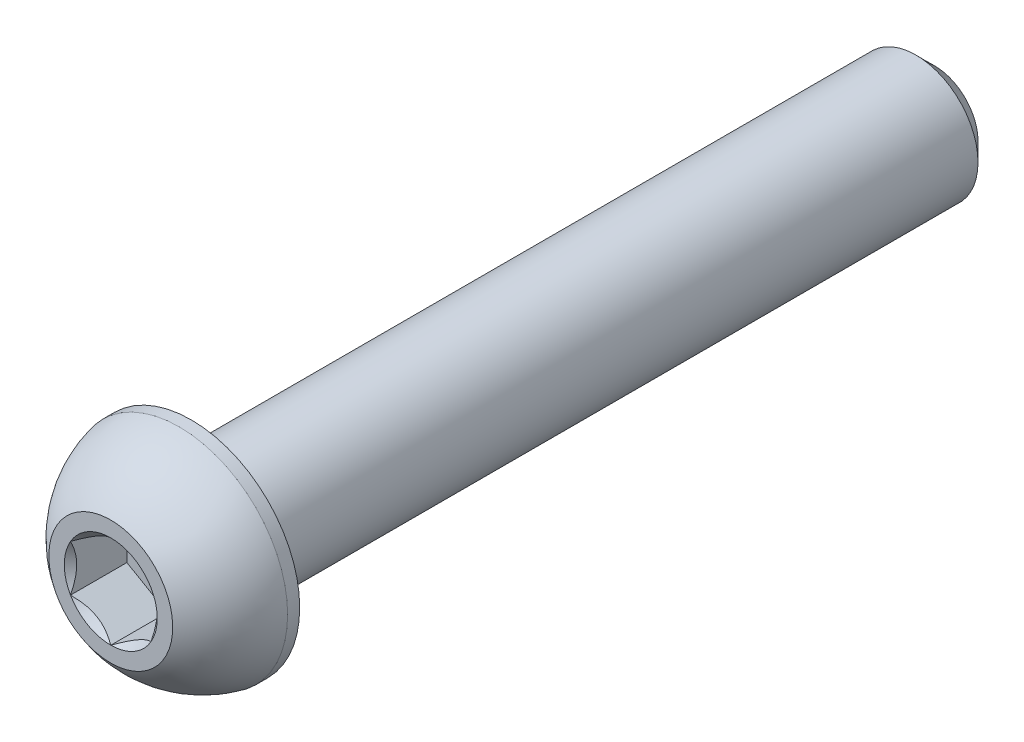
ISO-10303-21;
HEADER;
FILE_DESCRIPTION(('STEP AP214'),'2;1');
FILE_NAME('part.step','',(''),(''),'','','');
FILE_SCHEMA(('AUTOMOTIVE_DESIGN { 1 0 10303 214 1 1 1 1 }'));
ENDSEC;
DATA;
#1=APPLICATION_CONTEXT('core data for automotive mechanical design processes');
#2=APPLICATION_PROTOCOL_DEFINITION('international standard','automotive_design',2000,#1);
#3=PRODUCT_CONTEXT('',#1,'mechanical');
#4=PRODUCT('Part','Part','',(#3));
#5=PRODUCT_RELATED_PRODUCT_CATEGORY('part','',(#4));
#6=PRODUCT_DEFINITION_FORMATION('','',#4);
#7=PRODUCT_DEFINITION_CONTEXT('part definition',#1,'design');
#8=PRODUCT_DEFINITION('design','',#6,#7);
#9=PRODUCT_DEFINITION_SHAPE('','',#8);
#10=(LENGTH_UNIT() NAMED_UNIT(*) SI_UNIT(.MILLI.,.METRE.));
#11=(NAMED_UNIT(*) PLANE_ANGLE_UNIT() SI_UNIT($,.RADIAN.));
#12=(NAMED_UNIT(*) SI_UNIT($,.STERADIAN.) SOLID_ANGLE_UNIT());
#13=UNCERTAINTY_MEASURE_WITH_UNIT(LENGTH_MEASURE(1.E-05),#10,'distance_accuracy_value','');
#14=(GEOMETRIC_REPRESENTATION_CONTEXT(3) GLOBAL_UNCERTAINTY_ASSIGNED_CONTEXT((#13)) GLOBAL_UNIT_ASSIGNED_CONTEXT((#10,
#11,#12)) REPRESENTATION_CONTEXT('',''));
#15=CARTESIAN_POINT('',(0.,0.,0.));
#16=DIRECTION('',(0.,0.,1.));
#17=DIRECTION('',(1.,0.,0.));
#18=AXIS2_PLACEMENT_3D('',#15,#16,#17);
#19=CARTESIAN_POINT('',(0.,0.,-13.3));
#20=DIRECTION('',(0.,0.,1.));
#21=DIRECTION('',(1.,0.,0.));
#22=AXIS2_PLACEMENT_3D('',#19,#20,#21);
#23=PLANE('',#22);
#24=CARTESIAN_POINT('',(0.,0.,-13.3));
#25=DIRECTION('',(0.,0.,1.));
#26=DIRECTION('',(1.,0.,0.));
#27=AXIS2_PLACEMENT_3D('',#24,#25,#26);
#28=CIRCLE('',#27,0.700000000000034);
#29=CARTESIAN_POINT('',(0.700000000000034,0.,-13.3));
#30=VERTEX_POINT('',#29);
#31=EDGE_CURVE('E45',#30,#30,#28,.T.);
#32=ORIENTED_EDGE('',*,*,#31,.F.);
#33=EDGE_LOOP('',(#32));
#34=FACE_BOUND('',#33,.T.);
#35=ADVANCED_FACE('F42',(#34),#23,.F.);
#36=CARTESIAN_POINT('',(0.,0.,-13.3));
#37=DIRECTION('',(0.,0.,1.));
#38=DIRECTION('',(1.,0.,0.));
#39=AXIS2_PLACEMENT_3D('',#36,#37,#38);
#40=CONICAL_SURFACE('',#39,0.700000000000034,0.785398163397425);
#41=CARTESIAN_POINT('',(0.,0.,-13.));
#42=DIRECTION('',(0.,0.,1.));
#43=DIRECTION('',(1.,0.,0.));
#44=AXIS2_PLACEMENT_3D('',#41,#42,#43);
#45=CIRCLE('',#44,1.00000000000001);
#46=CARTESIAN_POINT('',(1.00000000000001,0.,-13.));
#47=VERTEX_POINT('',#46);
#48=EDGE_CURVE('E138',#47,#47,#45,.T.);
#49=ORIENTED_EDGE('',*,*,#48,.F.);
#50=EDGE_LOOP('',(#49));
#51=FACE_BOUND('',#50,.T.);
#52=ORIENTED_EDGE('',*,*,#31,.T.);
#53=EDGE_LOOP('',(#52));
#54=FACE_BOUND('',#53,.T.);
#55=ADVANCED_FACE('F159',(#51,#54),#40,.T.);
#56=CARTESIAN_POINT('',(0.,0.,0.));
#57=DIRECTION('',(0.,0.,1.));
#58=DIRECTION('',(1.,0.,0.));
#59=AXIS2_PLACEMENT_3D('',#56,#57,#58);
#60=CYLINDRICAL_SURFACE('',#59,1.00000000000001);
#61=CARTESIAN_POINT('',(0.,0.,-1.3));
#62=DIRECTION('',(0.,0.,1.));
#63=DIRECTION('',(1.,0.,0.));
#64=AXIS2_PLACEMENT_3D('',#61,#62,#63);
#65=CIRCLE('',#64,1.00000000000001);
#66=CARTESIAN_POINT('',(1.00000000000001,0.,-1.3));
#67=VERTEX_POINT('',#66);
#68=EDGE_CURVE('E12',#67,#67,#65,.T.);
#69=ORIENTED_EDGE('',*,*,#68,.F.);
#70=EDGE_LOOP('',(#69));
#71=FACE_BOUND('',#70,.T.);
#72=ORIENTED_EDGE('',*,*,#48,.T.);
#73=EDGE_LOOP('',(#72));
#74=FACE_BOUND('',#73,.T.);
#75=ADVANCED_FACE('F166',(#71,#74),#60,.T.);
#76=CARTESIAN_POINT('',(1.75,0.,-1.3));
#77=DIRECTION('',(0.,0.,-1.));
#78=DIRECTION('',(-1.,0.,0.));
#79=AXIS2_PLACEMENT_3D('',#76,#77,#78);
#80=PLANE('',#79);
#81=ORIENTED_EDGE('',*,*,#68,.T.);
#82=EDGE_LOOP('',(#81));
#83=FACE_BOUND('',#82,.T.);
#84=CARTESIAN_POINT('',(0.,0.,-1.3));
#85=DIRECTION('',(0.,0.,1.));
#86=DIRECTION('',(1.,0.,0.));
#87=AXIS2_PLACEMENT_3D('',#84,#85,#86);
#88=CIRCLE('',#87,1.75);
#89=CARTESIAN_POINT('',(1.75,0.,-1.3));
#90=VERTEX_POINT('',#89);
#91=EDGE_CURVE('E260',#90,#90,#88,.T.);
#92=ORIENTED_EDGE('',*,*,#91,.F.);
#93=EDGE_LOOP('',(#92));
#94=FACE_BOUND('',#93,.T.);
#95=ADVANCED_FACE('F169',(#83,#94),#80,.T.);
#96=CARTESIAN_POINT('',(0.65,-0.375277674973252,-0.91));
#97=DIRECTION('',(0.,0.,1.));
#98=DIRECTION('',(1.,0.,0.));
#99=AXIS2_PLACEMENT_3D('',#96,#97,#98);
#100=PLANE('',#99);
#101=DIRECTION('',(0.866025403784438,0.5,0.));
#102=VECTOR('',#101,1.);
#103=CARTESIAN_POINT('',(0.,-0.750555349946511,-0.91));
#104=LINE('',#103,#102);
#105=CARTESIAN_POINT('',(0.,-0.750555349946511,-0.91));
#106=VERTEX_POINT('',#105);
#107=CARTESIAN_POINT('',(0.65,-0.375277674973252,-0.91));
#108=VERTEX_POINT('',#107);
#109=EDGE_CURVE('E113',#106,#108,#104,.T.);
#110=ORIENTED_EDGE('',*,*,#109,.T.);
#111=DIRECTION('',(0.,1.,0.));
#112=VECTOR('',#111,1.);
#113=CARTESIAN_POINT('',(0.65,-0.375277674973252,-0.91));
#114=LINE('',#113,#112);
#115=CARTESIAN_POINT('',(0.65,0.375277674973256,-0.91));
#116=VERTEX_POINT('',#115);
#117=EDGE_CURVE('E296',#108,#116,#114,.T.);
#118=ORIENTED_EDGE('',*,*,#117,.T.);
#119=DIRECTION('',(-0.866025403784439,0.5,0.));
#120=VECTOR('',#119,1.);
#121=CARTESIAN_POINT('',(0.65,0.375277674973256,-0.91));
#122=LINE('',#121,#120);
#123=CARTESIAN_POINT('',(0.,0.750555349946512,-0.91));
#124=VERTEX_POINT('',#123);
#125=EDGE_CURVE('E292',#116,#124,#122,.T.);
#126=ORIENTED_EDGE('',*,*,#125,.T.);
#127=DIRECTION('',(-0.866025403784439,-0.5,0.));
#128=VECTOR('',#127,1.);
#129=CARTESIAN_POINT('',(0.,0.750555349946512,-0.91));
#130=LINE('',#129,#128);
#131=CARTESIAN_POINT('',(-0.649999999999998,0.375277674973256,-0.91));
#132=VERTEX_POINT('',#131);
#133=EDGE_CURVE('E288',#124,#132,#130,.T.);
#134=ORIENTED_EDGE('',*,*,#133,.T.);
#135=DIRECTION('',(0.,-1.,0.));
#136=VECTOR('',#135,1.);
#137=CARTESIAN_POINT('',(-0.649999999999998,0.375277674973256,-0.91));
#138=LINE('',#137,#136);
#139=CARTESIAN_POINT('',(-0.649999999999997,-0.375277674973256,-0.91));
#140=VERTEX_POINT('',#139);
#141=EDGE_CURVE('E284',#132,#140,#138,.T.);
#142=ORIENTED_EDGE('',*,*,#141,.T.);
#143=DIRECTION('',(0.866025403784438,-0.500000000000001,0.));
#144=VECTOR('',#143,1.);
#145=CARTESIAN_POINT('',(-0.649999999999997,-0.375277674973256,-0.91));
#146=LINE('',#145,#144);
#147=EDGE_CURVE('E268',#140,#106,#146,.T.);
#148=ORIENTED_EDGE('',*,*,#147,.T.);
#149=EDGE_LOOP('',(#110,#118,#126,#134,#142,#148));
#150=FACE_BOUND('',#149,.T.);
#151=ADVANCED_FACE('F162',(#150),#100,.T.);
#152=CARTESIAN_POINT('',(-0.649999999999997,-0.375277674973256,-0.91));
#153=DIRECTION('',(-0.500000000000001,-0.866025403784438,0.));
#154=DIRECTION('',(0.866025403784438,-0.500000000000001,0.));
#155=AXIS2_PLACEMENT_3D('',#152,#153,#154);
#156=PLANE('',#155);
#157=DIRECTION('',(0.,0.,1.));
#158=VECTOR('',#157,1.);
#159=CARTESIAN_POINT('',(-0.649999999999997,-0.375277674973256,-0.91));
#160=LINE('',#159,#158);
#161=CARTESIAN_POINT('',(-0.649999999999997,-0.375277674973259,0.));
#162=VERTEX_POINT('',#161);
#163=EDGE_CURVE('E120',#140,#162,#160,.T.);
#164=ORIENTED_EDGE('',*,*,#163,.T.);
#165=CARTESIAN_POINT('',(-0.650199999999997,-0.375162204919418,0.000115496696672807));
#166=CARTESIAN_POINT('',(-0.627846124557377,-0.388068220923647,-0.0127826378084549));
#167=CARTESIAN_POINT('',(-0.605119879467385,-0.401189224644023,-0.0249248451013643));
#168=CARTESIAN_POINT('',(-0.558778015356716,-0.427944712363067,-0.0471577551377746));
#169=CARTESIAN_POINT('',(-0.535157980959402,-0.441581745580625,-0.0572360751899938));
#170=CARTESIAN_POINT('',(-0.487526191293143,-0.469081972166423,-0.0744984835766257));
#171=CARTESIAN_POINT('',(-0.463526635406913,-0.482938122217769,-0.081726041484421));
#172=CARTESIAN_POINT('',(-0.41501058975479,-0.510948874235039,-0.0928707979999934));
#173=CARTESIAN_POINT('',(-0.390495555958118,-0.52510263559674,-0.096796297378132));
#174=CARTESIAN_POINT('',(-0.33061559766408,-0.559674345636867,-0.101776562665293));
#175=CARTESIAN_POINT('',(-0.295110807096765,-0.580173046028428,-0.100875515207342));
#176=CARTESIAN_POINT('',(-0.224845447682006,-0.620740770201245,-0.0915914386833309));
#177=CARTESIAN_POINT('',(-0.190086069560699,-0.640809106516445,-0.0831972369703432));
#178=CARTESIAN_POINT('',(-0.129041737491061,-0.676053068069351,-0.062954321492702));
#179=CARTESIAN_POINT('',(-0.102476138584916,-0.691390723748998,-0.0521615767354973));
#180=CARTESIAN_POINT('',(-0.0503858451009351,-0.721465068714141,-0.0278480685503986));
#181=CARTESIAN_POINT('',(-0.0248580811749664,-0.736203530088608,-0.0143361789927113));
#182=CARTESIAN_POINT('',(0.00019999999999743,-0.750670820000349,0.000115496696673118));
#183=B_SPLINE_CURVE_WITH_KNOTS('',3,(#165,#166,#167,#168,#169,#170,#171,#172,#173,#174,#175,
#176,#177,#178,#179,#180,#181,#182),.UNSPECIFIED.,.F.,.F.,(4,2,2,2,2,2,2,2,4),(0.,
0.0866236559063438,0.173752711623241,0.259496442803566,0.34502398028175,0.467267720550123,
0.589694037029333,0.687111308755476,0.78421567181366),.UNSPECIFIED.);
#184=CARTESIAN_POINT('',(0.,-0.750555349946512,0.));
#185=VERTEX_POINT('',#184);
#186=EDGE_CURVE('E102',#162,#185,#183,.T.);
#187=ORIENTED_EDGE('',*,*,#186,.T.);
#188=DIRECTION('',(0.,0.,1.));
#189=VECTOR('',#188,1.);
#190=CARTESIAN_POINT('',(0.,-0.750555349946511,-0.91));
#191=LINE('',#190,#189);
#192=EDGE_CURVE('E119',#106,#185,#191,.T.);
#193=ORIENTED_EDGE('',*,*,#192,.F.);
#194=ORIENTED_EDGE('',*,*,#147,.F.);
#195=EDGE_LOOP('',(#164,#187,#193,#194));
#196=FACE_BOUND('',#195,.T.);
#197=ADVANCED_FACE('F117',(#196),#156,.F.);
#198=CARTESIAN_POINT('',(0.,-0.750555349946511,-0.91));
#199=DIRECTION('',(0.500000000000001,-0.866025403784438,0.));
#200=DIRECTION('',(0.866025403784438,0.500000000000001,0.));
#201=AXIS2_PLACEMENT_3D('',#198,#199,#200);
#202=PLANE('',#201);
#203=ORIENTED_EDGE('',*,*,#192,.T.);
#204=CARTESIAN_POINT('',(-0.000200000000002532,-0.750670820000349,0.000115496696673219));
#205=CARTESIAN_POINT('',(0.0221538754426182,-0.737764803996121,-0.0127826378084547));
#206=CARTESIAN_POINT('',(0.0448801205326102,-0.724643800275745,-0.0249248451013643));
#207=CARTESIAN_POINT('',(0.0912219846432802,-0.6978883125567,-0.0471577551377752));
#208=CARTESIAN_POINT('',(0.114842019040594,-0.684251279339143,-0.0572360751899947));
#209=CARTESIAN_POINT('',(0.162473808706854,-0.656751052753344,-0.074498483576627));
#210=CARTESIAN_POINT('',(0.186473364593084,-0.642894902701998,-0.0817260414844226));
#211=CARTESIAN_POINT('',(0.234989410245208,-0.614884150684728,-0.0928707979999952));
#212=CARTESIAN_POINT('',(0.259504444041879,-0.600730389323027,-0.0967962973781341));
#213=CARTESIAN_POINT('',(0.319384402335918,-0.5661586792829,-0.101776562665295));
#214=CARTESIAN_POINT('',(0.354889192903233,-0.545659978891339,-0.100875515207344));
#215=CARTESIAN_POINT('',(0.425154552317992,-0.505092254718522,-0.0915914386833333));
#216=CARTESIAN_POINT('',(0.459913930439299,-0.485023918403322,-0.0831972369703457));
#217=CARTESIAN_POINT('',(0.520958262508937,-0.449779956850415,-0.0629543214927043));
#218=CARTESIAN_POINT('',(0.547523861415084,-0.434442301170768,-0.0521615767354993));
#219=CARTESIAN_POINT('',(0.599614154899066,-0.404367956205624,-0.0278480685503996));
#220=CARTESIAN_POINT('',(0.625141918825036,-0.389629494831156,-0.0143361789927117));
#221=CARTESIAN_POINT('',(0.6502,-0.375162204919414,0.000115496696673408));
#222=B_SPLINE_CURVE_WITH_KNOTS('',3,(#204,#205,#206,#207,#208,#209,#210,#211,#212,#213,#214,
#215,#216,#217,#218,#219,#220,#221),.UNSPECIFIED.,.F.,.F.,(4,2,2,2,2,2,2,2,4),(0.,
0.0866236559063447,0.173752711623243,0.259496442803569,0.345023980281754,0.467267720550126,
0.589694037029336,0.687111308755483,0.78421567181367),.UNSPECIFIED.);
#223=CARTESIAN_POINT('',(0.65,-0.375277674973254,0.));
#224=VERTEX_POINT('',#223);
#225=EDGE_CURVE('E109',#185,#224,#222,.T.);
#226=ORIENTED_EDGE('',*,*,#225,.T.);
#227=DIRECTION('',(0.,0.,1.));
#228=VECTOR('',#227,1.);
#229=CARTESIAN_POINT('',(0.65,-0.375277674973252,-0.91));
#230=LINE('',#229,#228);
#231=EDGE_CURVE('E65',#108,#224,#230,.T.);
#232=ORIENTED_EDGE('',*,*,#231,.F.);
#233=ORIENTED_EDGE('',*,*,#109,.F.);
#234=EDGE_LOOP('',(#203,#226,#232,#233));
#235=FACE_BOUND('',#234,.T.);
#236=ADVANCED_FACE('F124',(#235),#202,.F.);
#237=CARTESIAN_POINT('',(0.65,-0.375277674973252,-0.91));
#238=DIRECTION('',(1.,0.,0.));
#239=DIRECTION('',(0.,0.,-1.));
#240=AXIS2_PLACEMENT_3D('',#237,#238,#239);
#241=PLANE('',#240);
#242=ORIENTED_EDGE('',*,*,#231,.T.);
#243=CARTESIAN_POINT('',(0.65,-0.748456856201993,0.240750690384005));
#244=CARTESIAN_POINT('',(0.65,-0.711991073878816,0.213280285933621));
#245=CARTESIAN_POINT('',(0.65,-0.675139640082794,0.186265195476194));
#246=CARTESIAN_POINT('',(0.65,-0.600031183452819,0.133629348283163));
#247=CARTESIAN_POINT('',(0.65,-0.561765441270894,0.108021106129097));
#248=CARTESIAN_POINT('',(0.65,-0.481525479406319,0.0577374937624613));
#249=CARTESIAN_POINT('',(0.65,-0.439464253670484,0.0331988021987558));
#250=CARTESIAN_POINT('',(0.65,-0.353242719412717,-0.0116853403013637));
#251=CARTESIAN_POINT('',(0.65,-0.309090130602523,-0.0320449275105113));
#252=CARTESIAN_POINT('',(0.65,-0.242810057498668,-0.0569512709113473));
#253=CARTESIAN_POINT('',(0.65,-0.221667349821687,-0.0640992725852869));
#254=CARTESIAN_POINT('',(0.65,-0.178882845085541,-0.0767024705474531));
#255=CARTESIAN_POINT('',(0.65,-0.157241013753962,-0.0821575502168733));
#256=CARTESIAN_POINT('',(0.65,-0.0924732258239327,-0.0953392346897749));
#257=CARTESIAN_POINT('',(0.65,-0.0486986201802761,-0.100206440230559));
#258=CARTESIAN_POINT('',(0.65,0.0373331587621249,-0.10085551076922));
#259=CARTESIAN_POINT('',(0.65,0.0795879418799275,-0.0969596606801929));
#260=CARTESIAN_POINT('',(0.65,0.142230570834976,-0.0855076744021655));
#261=CARTESIAN_POINT('',(0.65,0.163174856664669,-0.080685435763269));
#262=CARTESIAN_POINT('',(0.65,0.204615212735414,-0.0693999000452562));
#263=CARTESIAN_POINT('',(0.65,0.225111320324617,-0.0629367402798553));
#264=CARTESIAN_POINT('',(0.65,0.289638534772371,-0.0401559078683569));
#265=CARTESIAN_POINT('',(0.65,0.332748206875051,-0.0212427548657985));
#266=CARTESIAN_POINT('',(0.65,0.416943840013234,0.0208112818887808));
#267=CARTESIAN_POINT('',(0.65,0.45802183453077,0.0439673547577785));
#268=CARTESIAN_POINT('',(0.65,0.53652923324599,0.0917266397180912));
#269=CARTESIAN_POINT('',(0.65,0.574038509134623,0.116200758127156));
#270=CARTESIAN_POINT('',(0.65,0.647609691485458,0.166623456014885));
#271=CARTESIAN_POINT('',(0.65,0.683680924535921,0.192558343655291));
#272=CARTESIAN_POINT('',(0.65,0.719356204751142,0.218966877397434));
#273=B_SPLINE_CURVE_WITH_KNOTS('',3,(#243,#244,#245,#246,#247,#248,#249,#250,#251,#252,#253,
#254,#255,#256,#257,#258,#259,#260,#261,#262,#263,#264,#265,#266,#267,#268,#269,#270,#271,#272),
.UNSPECIFIED.,.F.,.F.,(4,2,2,2,2,2,2,2,2,2,2,2,2,2,4),(0.,0.137014030009578,0.275096405762551,
0.421060359835522,0.566522128775089,0.633415056462916,0.7003125911218,0.831534924508334,
0.958010408789896,1.02242898521265,1.08684217280828,1.22766018796412,1.36899252873703,
1.50330165960873,1.63651263433843),.UNSPECIFIED.);
#274=CARTESIAN_POINT('',(0.65,0.375277674973254,0.));
#275=VERTEX_POINT('',#274);
#276=EDGE_CURVE('E189',#224,#275,#273,.T.);
#277=ORIENTED_EDGE('',*,*,#276,.T.);
#278=DIRECTION('',(0.,0.,1.));
#279=VECTOR('',#278,1.);
#280=CARTESIAN_POINT('',(0.65,0.375277674973256,-0.91));
#281=LINE('',#280,#279);
#282=EDGE_CURVE('E269',#116,#275,#281,.T.);
#283=ORIENTED_EDGE('',*,*,#282,.F.);
#284=ORIENTED_EDGE('',*,*,#117,.F.);
#285=EDGE_LOOP('',(#242,#277,#283,#284));
#286=FACE_BOUND('',#285,.T.);
#287=ADVANCED_FACE('F234',(#286),#241,.F.);
#288=CARTESIAN_POINT('',(0.65,0.375277674973256,-0.91));
#289=DIRECTION('',(0.5,0.866025403784439,0.));
#290=DIRECTION('',(-0.866025403784439,0.5,0.));
#291=AXIS2_PLACEMENT_3D('',#288,#289,#290);
#292=PLANE('',#291);
#293=ORIENTED_EDGE('',*,*,#282,.T.);
#294=CARTESIAN_POINT('',(0.6502,0.375162204919418,0.000115496696675192));
#295=CARTESIAN_POINT('',(0.62784612455738,0.388068220923646,-0.0127826378084528));
#296=CARTESIAN_POINT('',(0.605119879467388,0.401189224644023,-0.0249248451013623));
#297=CARTESIAN_POINT('',(0.558778015356718,0.427944712363067,-0.0471577551377729));
#298=CARTESIAN_POINT('',(0.535157980959404,0.441581745580624,-0.0572360751899923));
#299=CARTESIAN_POINT('',(0.487526191293144,0.469081972166423,-0.0744984835766245));
#300=CARTESIAN_POINT('',(0.463526635406914,0.482938122217769,-0.08172604148442));
#301=CARTESIAN_POINT('',(0.415010589754791,0.510948874235039,-0.0928707979999926));
#302=CARTESIAN_POINT('',(0.390495555958119,0.52510263559674,-0.0967962973781314));
#303=CARTESIAN_POINT('',(0.33061559766408,0.559674345636867,-0.101776562665292));
#304=CARTESIAN_POINT('',(0.295110807096765,0.580173046028428,-0.100875515207341));
#305=CARTESIAN_POINT('',(0.224845447682006,0.620740770201245,-0.0915914386833307));
#306=CARTESIAN_POINT('',(0.190086069560699,0.640809106516445,-0.083197236970343));
#307=CARTESIAN_POINT('',(0.129041737491061,0.676053068069352,-0.0629543214927018));
#308=CARTESIAN_POINT('',(0.102476138584915,0.691390723748998,-0.0521615767354971));
#309=CARTESIAN_POINT('',(0.0503858451009338,0.721465068714142,-0.0278480685503981));
#310=CARTESIAN_POINT('',(0.0248580811749648,0.736203530088609,-0.0143361789927107));
#311=CARTESIAN_POINT('',(-0.000199999999999354,0.75067082000035,0.000115496696673986));
#312=B_SPLINE_CURVE_WITH_KNOTS('',3,(#294,#295,#296,#297,#298,#299,#300,#301,#302,#303,#304,
#305,#306,#307,#308,#309,#310,#311),.UNSPECIFIED.,.F.,.F.,(4,2,2,2,2,2,2,2,4),(0.,
0.0866236559063445,0.173752711623243,0.259496442803569,0.345023980281753,0.467267720550126,
0.589694037029336,0.687111308755481,0.784215671813665),.UNSPECIFIED.);
#313=CARTESIAN_POINT('',(0.,0.750555349946512,0.));
#314=VERTEX_POINT('',#313);
#315=EDGE_CURVE('E143',#275,#314,#312,.T.);
#316=ORIENTED_EDGE('',*,*,#315,.T.);
#317=DIRECTION('',(0.,0.,1.));
#318=VECTOR('',#317,1.);
#319=CARTESIAN_POINT('',(0.,0.750555349946512,-0.91));
#320=LINE('',#319,#318);
#321=EDGE_CURVE('E273',#124,#314,#320,.T.);
#322=ORIENTED_EDGE('',*,*,#321,.F.);
#323=ORIENTED_EDGE('',*,*,#125,.F.);
#324=EDGE_LOOP('',(#293,#316,#322,#323));
#325=FACE_BOUND('',#324,.T.);
#326=ADVANCED_FACE('F230',(#325),#292,.F.);
#327=CARTESIAN_POINT('',(0.,0.750555349946512,-0.91));
#328=DIRECTION('',(-0.5,0.866025403784439,0.));
#329=DIRECTION('',(-0.866025403784439,-0.5,0.));
#330=AXIS2_PLACEMENT_3D('',#327,#328,#329);
#331=PLANE('',#330);
#332=ORIENTED_EDGE('',*,*,#321,.T.);
#333=CARTESIAN_POINT('',(0.000200000000000687,0.75067082000035,0.000115496696674086));
#334=CARTESIAN_POINT('',(-0.0221538754426199,0.737764803996122,-0.0127826378084537));
#335=CARTESIAN_POINT('',(-0.0448801205326119,0.724643800275746,-0.0249248451013632));
#336=CARTESIAN_POINT('',(-0.0912219846432817,0.697888312556701,-0.0471577551377739));
#337=CARTESIAN_POINT('',(-0.114842019040596,0.684251279339144,-0.0572360751899933));
#338=CARTESIAN_POINT('',(-0.162473808706855,0.656751052753345,-0.0744984835766254));
#339=CARTESIAN_POINT('',(-0.186473364593085,0.642894902701999,-0.0817260414844208));
#340=CARTESIAN_POINT('',(-0.234989410245209,0.614884150684729,-0.0928707979999933));
#341=CARTESIAN_POINT('',(-0.25950444404188,0.600730389323028,-0.0967962973781321));
#342=CARTESIAN_POINT('',(-0.319384402335919,0.566158679282901,-0.101776562665293));
#343=CARTESIAN_POINT('',(-0.354889192903234,0.545659978891341,-0.100875515207342));
#344=CARTESIAN_POINT('',(-0.425154552317993,0.505092254718524,-0.0915914386833313));
#345=CARTESIAN_POINT('',(-0.4599139304393,0.485023918403323,-0.0831972369703435));
#346=CARTESIAN_POINT('',(-0.520958262508938,0.449779956850417,-0.0629543214927024));
#347=CARTESIAN_POINT('',(-0.547523861415084,0.43444230117077,-0.0521615767354977));
#348=CARTESIAN_POINT('',(-0.599614154899065,0.404367956205627,-0.0278480685503987));
#349=CARTESIAN_POINT('',(-0.625141918825034,0.389629494831159,-0.0143361789927112));
#350=CARTESIAN_POINT('',(-0.650199999999998,0.375162204919418,0.0001154966966736));
#351=B_SPLINE_CURVE_WITH_KNOTS('',3,(#333,#334,#335,#336,#337,#338,#339,#340,#341,#342,#343,
#344,#345,#346,#347,#348,#349,#350),.UNSPECIFIED.,.F.,.F.,(4,2,2,2,2,2,2,2,4),(0.,
0.0866236559063444,0.173752711623242,0.259496442803568,0.345023980281752,0.467267720550125,
0.589694037029335,0.68711130875548,0.784215671813665),.UNSPECIFIED.);
#352=CARTESIAN_POINT('',(-0.649999999999998,0.375277674973256,0.));
#353=VERTEX_POINT('',#352);
#354=EDGE_CURVE('E199',#314,#353,#351,.T.);
#355=ORIENTED_EDGE('',*,*,#354,.T.);
#356=DIRECTION('',(0.,0.,1.));
#357=VECTOR('',#356,1.);
#358=CARTESIAN_POINT('',(-0.649999999999998,0.375277674973256,-0.91));
#359=LINE('',#358,#357);
#360=EDGE_CURVE('E277',#132,#353,#359,.T.);
#361=ORIENTED_EDGE('',*,*,#360,.F.);
#362=ORIENTED_EDGE('',*,*,#133,.F.);
#363=EDGE_LOOP('',(#332,#355,#361,#362));
#364=FACE_BOUND('',#363,.T.);
#365=ADVANCED_FACE('F226',(#364),#331,.F.);
#366=CARTESIAN_POINT('',(-0.649999999999998,0.375277674973256,-0.91));
#367=DIRECTION('',(-1.,0.,0.));
#368=DIRECTION('',(0.,-1.,0.));
#369=AXIS2_PLACEMENT_3D('',#366,#367,#368);
#370=PLANE('',#369);
#371=ORIENTED_EDGE('',*,*,#360,.T.);
#372=CARTESIAN_POINT('',(-0.649999999999997,-0.748456856202,0.240750690384008));
#373=CARTESIAN_POINT('',(-0.649999999999997,-0.711991073878822,0.213280285933623));
#374=CARTESIAN_POINT('',(-0.649999999999997,-0.6751396400828,0.186265195476196));
#375=CARTESIAN_POINT('',(-0.649999999999997,-0.600031183452825,0.133629348283164));
#376=CARTESIAN_POINT('',(-0.649999999999997,-0.561765441270899,0.108021106129098));
#377=CARTESIAN_POINT('',(-0.649999999999997,-0.481525479406324,0.0577374937624617));
#378=CARTESIAN_POINT('',(-0.649999999999997,-0.439464253670489,0.0331988021987558));
#379=CARTESIAN_POINT('',(-0.649999999999997,-0.353242719412722,-0.0116853403013644));
#380=CARTESIAN_POINT('',(-0.649999999999997,-0.309090130602527,-0.0320449275105122));
#381=CARTESIAN_POINT('',(-0.649999999999997,-0.242810057498671,-0.0569512709113487));
#382=CARTESIAN_POINT('',(-0.649999999999998,-0.221667349821691,-0.0640992725852885));
#383=CARTESIAN_POINT('',(-0.649999999999998,-0.178882845085544,-0.076702470547455));
#384=CARTESIAN_POINT('',(-0.649999999999998,-0.157241013753965,-0.0821575502168752));
#385=CARTESIAN_POINT('',(-0.649999999999998,-0.092473225823936,-0.0953392346897771));
#386=CARTESIAN_POINT('',(-0.649999999999998,-0.0486986201802792,-0.100206440230561));
#387=CARTESIAN_POINT('',(-0.649999999999998,0.0373331587621221,-0.100855510769223));
#388=CARTESIAN_POINT('',(-0.649999999999998,0.0795879418799249,-0.0969596606801957));
#389=CARTESIAN_POINT('',(-0.649999999999998,0.142230570834973,-0.0855076744021684));
#390=CARTESIAN_POINT('',(-0.649999999999998,0.163174856664667,-0.080685435763272));
#391=CARTESIAN_POINT('',(-0.649999999999998,0.204615212735411,-0.0693999000452592));
#392=CARTESIAN_POINT('',(-0.649999999999998,0.225111320324615,-0.0629367402798583));
#393=CARTESIAN_POINT('',(-0.649999999999998,0.289638534772368,-0.0401559078683601));
#394=CARTESIAN_POINT('',(-0.649999999999998,0.332748206875048,-0.0212427548658018));
#395=CARTESIAN_POINT('',(-0.649999999999998,0.41694384001323,0.0208112818887772));
#396=CARTESIAN_POINT('',(-0.649999999999998,0.458021834530766,0.0439673547577745));
#397=CARTESIAN_POINT('',(-0.649999999999998,0.536529233245986,0.0917266397180868));
#398=CARTESIAN_POINT('',(-0.649999999999998,0.574038509134618,0.116200758127151));
#399=CARTESIAN_POINT('',(-0.649999999999999,0.647609691485453,0.166623456014881));
#400=CARTESIAN_POINT('',(-0.649999999999999,0.683680924535915,0.192558343655286));
#401=CARTESIAN_POINT('',(-0.649999999999999,0.719356204751137,0.218966877397429));
#402=B_SPLINE_CURVE_WITH_KNOTS('',3,(#372,#373,#374,#375,#376,#377,#378,#379,#380,#381,#382,
#383,#384,#385,#386,#387,#388,#389,#390,#391,#392,#393,#394,#395,#396,#397,#398,#399,#400,#401),
.UNSPECIFIED.,.F.,.F.,(4,2,2,2,2,2,2,2,2,2,2,2,2,2,4),(0.,0.13701403000958,0.275096405762553,
0.421060359835525,0.566522128775094,0.633415056462921,0.700312591121805,0.83153492450834,
0.958010408789902,1.02242898521266,1.08684217280828,1.22766018796413,1.36899252873703,
1.50330165960873,1.63651263433843),.UNSPECIFIED.);
#403=EDGE_CURVE('E122',#353,#162,#402,.F.);
#404=ORIENTED_EDGE('',*,*,#403,.T.);
#405=ORIENTED_EDGE('',*,*,#163,.F.);
#406=ORIENTED_EDGE('',*,*,#141,.F.);
#407=EDGE_LOOP('',(#371,#404,#405,#406));
#408=FACE_BOUND('',#407,.T.);
#409=ADVANCED_FACE('F223',(#408),#370,.F.);
#410=CARTESIAN_POINT('',(0.,0.,0.));
#411=DIRECTION('',(0.,0.,1.));
#412=DIRECTION('',(1.,0.,0.));
#413=AXIS2_PLACEMENT_3D('',#410,#411,#412);
#414=CONICAL_SURFACE('',#413,0.750555349946512,0.78539816339745);
#415=CARTESIAN_POINT('',(0.,0.,0.));
#416=DIRECTION('',(0.,0.,1.));
#417=DIRECTION('',(1.,0.,0.));
#418=AXIS2_PLACEMENT_3D('',#415,#416,#417);
#419=CIRCLE('',#418,0.750555349946512);
#420=EDGE_CURVE('E99',#162,#185,#419,.T.);
#421=ORIENTED_EDGE('',*,*,#420,.T.);
#422=ORIENTED_EDGE('',*,*,#186,.F.);
#423=EDGE_LOOP('',(#421,#422));
#424=FACE_BOUND('',#423,.T.);
#425=ADVANCED_FACE('F100',(#424),#414,.F.);
#426=EDGE_CURVE('E57',#185,#224,#419,.T.);
#427=ORIENTED_EDGE('',*,*,#426,.T.);
#428=ORIENTED_EDGE('',*,*,#225,.F.);
#429=EDGE_LOOP('',(#427,#428));
#430=FACE_BOUND('',#429,.T.);
#431=ADVANCED_FACE('F110',(#430),#414,.F.);
#432=EDGE_CURVE('E135',#224,#275,#419,.T.);
#433=ORIENTED_EDGE('',*,*,#432,.T.);
#434=ORIENTED_EDGE('',*,*,#276,.F.);
#435=EDGE_LOOP('',(#433,#434));
#436=FACE_BOUND('',#435,.T.);
#437=ADVANCED_FACE('F184',(#436),#414,.F.);
#438=EDGE_CURVE('E139',#275,#314,#419,.T.);
#439=ORIENTED_EDGE('',*,*,#438,.T.);
#440=ORIENTED_EDGE('',*,*,#315,.F.);
#441=EDGE_LOOP('',(#439,#440));
#442=FACE_BOUND('',#441,.T.);
#443=ADVANCED_FACE('F322',(#442),#414,.F.);
#444=EDGE_CURVE('E142',#314,#353,#419,.T.);
#445=ORIENTED_EDGE('',*,*,#444,.T.);
#446=ORIENTED_EDGE('',*,*,#354,.F.);
#447=EDGE_LOOP('',(#445,#446));
#448=FACE_BOUND('',#447,.T.);
#449=ADVANCED_FACE('F318',(#448),#414,.F.);
#450=EDGE_CURVE('E107',#353,#162,#419,.T.);
#451=ORIENTED_EDGE('',*,*,#450,.T.);
#452=ORIENTED_EDGE('',*,*,#403,.F.);
#453=EDGE_LOOP('',(#451,#452));
#454=FACE_BOUND('',#453,.T.);
#455=ADVANCED_FACE('F248',(#454),#414,.F.);
#456=CARTESIAN_POINT('',(0.,-1.00000000000001,0.));
#457=DIRECTION('',(0.,0.,-1.));
#458=DIRECTION('',(-1.,0.,0.));
#459=AXIS2_PLACEMENT_3D('',#456,#457,#458);
#460=PLANE('',#459);
#461=ORIENTED_EDGE('',*,*,#450,.F.);
#462=ORIENTED_EDGE('',*,*,#444,.F.);
#463=ORIENTED_EDGE('',*,*,#438,.F.);
#464=ORIENTED_EDGE('',*,*,#432,.F.);
#465=ORIENTED_EDGE('',*,*,#426,.F.);
#466=ORIENTED_EDGE('',*,*,#420,.F.);
#467=EDGE_LOOP('',(#461,#462,#463,#464,#465,#466));
#468=FACE_BOUND('',#467,.T.);
#469=CARTESIAN_POINT('',(0.,0.,0.));
#470=DIRECTION('',(0.,0.,1.));
#471=DIRECTION('',(1.,0.,0.));
#472=AXIS2_PLACEMENT_3D('',#469,#470,#471);
#473=CIRCLE('',#472,1.00000000000001);
#474=CARTESIAN_POINT('',(0.,-1.00000000000001,0.));
#475=VERTEX_POINT('',#474);
#476=EDGE_CURVE('E256',#475,#475,#473,.T.);
#477=ORIENTED_EDGE('',*,*,#476,.T.);
#478=EDGE_LOOP('',(#477));
#479=FACE_BOUND('',#478,.T.);
#480=ADVANCED_FACE('F131',(#468,#479),#460,.F.);
#481=CARTESIAN_POINT('',(0.,0.,-1.48575791855203));
#482=DIRECTION('',(0.,0.,1.));
#483=DIRECTION('',(0.,-1.,0.));
#484=AXIS2_PLACEMENT_3D('',#481,#482,#483);
#485=SPHERICAL_SURFACE('',#484,1.79094293391502);
#486=CARTESIAN_POINT('',(0.,0.,-1.105));
#487=DIRECTION('',(0.,0.,1.));
#488=DIRECTION('',(1.,0.,0.));
#489=AXIS2_PLACEMENT_3D('',#486,#487,#488);
#490=CIRCLE('',#489,1.75);
#491=CARTESIAN_POINT('',(0.,-1.75,-1.105));
#492=VERTEX_POINT('',#491);
#493=EDGE_CURVE('E128',#492,#492,#490,.T.);
#494=CARTESIAN_POINT('',(0.,-1.00000000000001,0.));
#495=CARTESIAN_POINT('',(0.,-1.01182643004198,-0.00795982137329927));
#496=CARTESIAN_POINT('',(0.,-1.02355778185813,-0.0160609033918179));
#497=CARTESIAN_POINT('',(0.,-1.04682372823727,-0.0325408445171076));
#498=CARTESIAN_POINT('',(0.,-1.05835832280026,-0.0409197036238785));
#499=CARTESIAN_POINT('',(0.,-1.0812241538715,-0.0579504547234862));
#500=CARTESIAN_POINT('',(0.,-1.09255539037975,-0.0666023467163229));
#501=CARTESIAN_POINT('',(0.,-1.11500805055769,-0.0841742212604434));
#502=CARTESIAN_POINT('',(0.,-1.12612947422739,-0.0930942038117272));
#503=CARTESIAN_POINT('',(0.,-1.14815616552584,-0.111197175650233));
#504=CARTESIAN_POINT('',(0.,-1.1590614331546,-0.120380164937455));
#505=CARTESIAN_POINT('',(0.,-1.18064959458059,-0.139003913410275));
#506=CARTESIAN_POINT('',(0.,-1.19133248837781,-0.148444672595872));
#507=CARTESIAN_POINT('',(0.,-1.21246981057065,-0.167578577862459));
#508=CARTESIAN_POINT('',(0.,-1.22292423896626,-0.177271723943447));
#509=CARTESIAN_POINT('',(0.,-1.24359866921303,-0.196904875866591));
#510=CARTESIAN_POINT('',(0.,-1.2538186710642,-0.206844881708745));
#511=CARTESIAN_POINT('',(0.,-1.27401842070911,-0.226966085317752));
#512=CARTESIAN_POINT('',(0.,-1.28399816850286,-0.237147283084603));
#513=CARTESIAN_POINT('',(0.,-1.30371171952533,-0.257745065161795));
#514=CARTESIAN_POINT('',(0.,-1.31344552275405,-0.268161649472135));
#515=CARTESIAN_POINT('',(0.,-1.33266163437493,-0.289224265040536));
#516=CARTESIAN_POINT('',(0.,-1.34214394276707,-0.299870296298597));
#517=CARTESIAN_POINT('',(0.,-1.36085165784783,-0.321385735333565));
#518=CARTESIAN_POINT('',(0.,-1.37007706453644,-0.332255143110472));
#519=CARTESIAN_POINT('',(0.,-1.3882657158298,-0.354211137383978));
#520=CARTESIAN_POINT('',(0.,-1.39722896043454,-0.365297723880577));
#521=CARTESIAN_POINT('',(0.,-1.41488817666624,-0.387681753957667));
#522=CARTESIAN_POINT('',(0.,-1.42358414829318,-0.398979197538157));
#523=CARTESIAN_POINT('',(0.,-1.44070386007593,-0.421778499915324));
#524=CARTESIAN_POINT('',(0.,-1.44912760023172,-0.433280358712));
#525=CARTESIAN_POINT('',(0.,-1.46569804580678,-0.456481933095085));
#526=CARTESIAN_POINT('',(0.,-1.47384475122604,-0.468181648681495));
#527=CARTESIAN_POINT('',(0.,-1.48985648202944,-0.491772265398509));
#528=CARTESIAN_POINT('',(0.,-1.49772150741359,-0.503663166529114));
#529=CARTESIAN_POINT('',(0.,-1.51316539346377,-0.527629374073879));
#530=CARTESIAN_POINT('',(0.,-1.5207442541298,-0.539704680488038));
#531=CARTESIAN_POINT('',(0.,-1.53561148923356,-0.564032813190312));
#532=CARTESIAN_POINT('',(0.,-1.54289986367127,-0.576285639478425));
#533=CARTESIAN_POINT('',(0.,-1.55718197044511,-0.600961825296145));
#534=CARTESIAN_POINT('',(0.,-1.56417570278122,-0.61338518482575));
#535=CARTESIAN_POINT('',(0.,-1.57786453748518,-0.638395353254957));
#536=CARTESIAN_POINT('',(0.,-1.58455963985302,-0.650982162154558));
#537=CARTESIAN_POINT('',(0.,-1.59764739703439,-0.676312052252457));
#538=CARTESIAN_POINT('',(0.,-1.60404005184792,-0.689055133450757));
#539=CARTESIAN_POINT('',(0.,-1.61651926879161,-0.714690301967474));
#540=CARTESIAN_POINT('',(0.,-1.62260583092177,-0.727582389285892));
#541=CARTESIAN_POINT('',(0.,-1.63446939190682,-0.753508218899792));
#542=CARTESIAN_POINT('',(0.,-1.64024639076172,-0.766541961195273));
#543=CARTESIAN_POINT('',(0.,-1.65148753111412,-0.79274366884897));
#544=CARTESIAN_POINT('',(0.,-1.65695167261162,-0.805911634207186));
#545=CARTESIAN_POINT('',(0.,-1.66756398257888,-0.832374279532718));
#546=CARTESIAN_POINT('',(0.,-1.67271215104863,-0.845668959500033));
#547=CARTESIAN_POINT('',(0.,-1.68268957938988,-0.872377453353669));
#548=CARTESIAN_POINT('',(0.,-1.68751883926138,-0.885791267239989));
#549=CARTESIAN_POINT('',(0.,-1.69685569693965,-0.912730380247454));
#550=CARTESIAN_POINT('',(0.,-1.70136329474644,-0.926255679368598));
#551=CARTESIAN_POINT('',(0.,-1.7100542572701,-0.953410050828004));
#552=CARTESIAN_POINT('',(0.,-1.71423762198697,-0.967039123166265));
#553=CARTESIAN_POINT('',(0.,-1.72227773581392,-0.994393268989346));
#554=CARTESIAN_POINT('',(0.,-1.72613448492398,-1.00811834247417));
#555=CARTESIAN_POINT('',(0.,-1.73351915771601,-1.03565666706645));
#556=CARTESIAN_POINT('',(0.,-1.73704708139798,-1.04946991817391));
#557=CARTESIAN_POINT('',(0.,-1.74377213155194,-1.07717671194072));
#558=CARTESIAN_POINT('',(0.,-1.74696925802394,-1.09107025460008));
#559=CARTESIAN_POINT('',(0.,-1.75,-1.105));
#560=B_SPLINE_CURVE_WITH_KNOTS('',3,(#494,#495,#496,#497,#498,#499,#500,#501,#502,#503,#504,
#505,#506,#507,#508,#509,#510,#511,#512,#513,#514,#515,#516,#517,#518,#519,#520,#521,#522,#523,
#524,#525,#526,#527,#528,#529,#530,#531,#532,#533,#534,#535,#536,#537,#538,#539,#540,#541,#542,
#543,#544,#545,#546,#547,#548,#549,#550,#551,#552,#553,#554,#555,#556,#557,#558,#559),
.UNSPECIFIED.,.F.,.F.,(4,2,2,2,2,2,2,2,2,2,2,2,2,2,2,2,2,2,2,2,2,2,2,2,2,2,2,2,2,2,2,2,4),(0.,
0.0427658943058258,0.0855317886116518,0.128297682917478,0.171063577223303,0.213829471529129,
0.256595365834955,0.299361260140781,0.342127154446607,0.384893048752432,0.427658943058258,
0.470424837364084,0.51319073166991,0.555956625975736,0.598722520281562,0.641488414587387,
0.684254308893213,0.727020203199039,0.769786097504865,0.812551991810691,0.855317886116516,
0.898083780422342,0.940849674728168,0.983615569033994,1.02638146333982,1.06914735764565,
1.11191325195147,1.1546791462573,1.19744504056312,1.24021093486895,1.28297682917477,
1.3257427234806,1.36850861778643),.UNSPECIFIED.);
#561=EDGE_CURVE('BSEAM244',#475,#492,#560,.T.);
#562=ORIENTED_EDGE('',*,*,#476,.F.);
#563=ORIENTED_EDGE('',*,*,#493,.T.);
#564=ORIENTED_EDGE('',*,*,#561,.T.);
#565=ORIENTED_EDGE('',*,*,#561,.F.);
#566=EDGE_LOOP('',(#562,#564,#563,#565));
#567=FACE_BOUND('',#566,.T.);
#568=ADVANCED_FACE('F244',(#567),#485,.T.);
#569=CARTESIAN_POINT('',(0.,0.,0.));
#570=DIRECTION('',(0.,0.,1.));
#571=DIRECTION('',(1.,0.,0.));
#572=AXIS2_PLACEMENT_3D('',#569,#570,#571);
#573=CYLINDRICAL_SURFACE('',#572,1.75);
#574=ORIENTED_EDGE('',*,*,#493,.F.);
#575=EDGE_LOOP('',(#574));
#576=FACE_BOUND('',#575,.T.);
#577=ORIENTED_EDGE('',*,*,#91,.T.);
#578=EDGE_LOOP('',(#577));
#579=FACE_BOUND('',#578,.T.);
#580=ADVANCED_FACE('F180',(#576,#579),#573,.T.);
#581=CLOSED_SHELL('',(#35,#55,#75,#95,#151,#197,#236,#287,#326,#365,#409,#425,#431,#437,#443,
#449,#455,#480,#568,#580));
#582=MANIFOLD_SOLID_BREP('B2',#581);
#583=ADVANCED_BREP_SHAPE_REPRESENTATION('',(#18,#582),#14);
#584=SHAPE_DEFINITION_REPRESENTATION(#9,#583);
ENDSEC;
END-ISO-10303-21;
